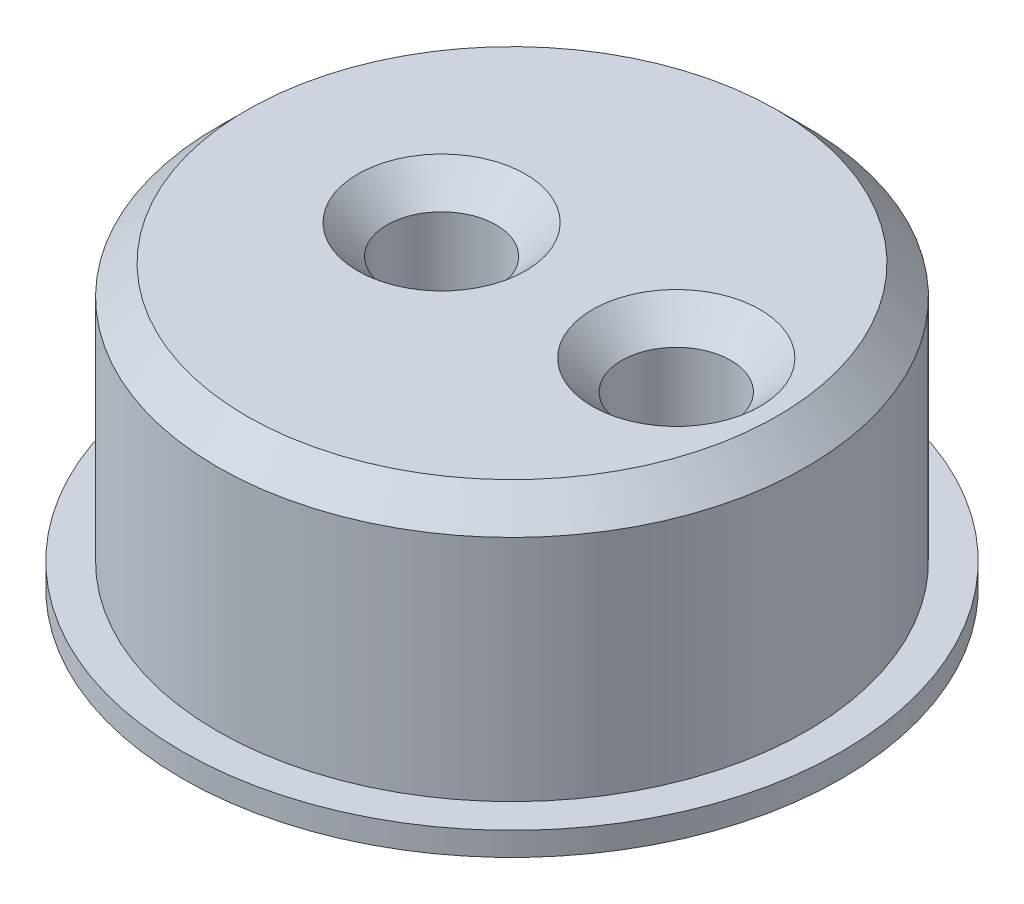
ISO-10303-21;
HEADER;
FILE_DESCRIPTION(('STEP AP214'),'2;1');
FILE_NAME('part.step','',(''),(''),'','','');
FILE_SCHEMA(('AUTOMOTIVE_DESIGN { 1 0 10303 214 1 1 1 1 }'));
ENDSEC;
DATA;
#1=APPLICATION_CONTEXT('core data for automotive mechanical design processes');
#2=APPLICATION_PROTOCOL_DEFINITION('international standard','automotive_design',2000,#1);
#3=PRODUCT_CONTEXT('',#1,'mechanical');
#4=PRODUCT('Part','Part','',(#3));
#5=PRODUCT_RELATED_PRODUCT_CATEGORY('part','',(#4));
#6=PRODUCT_DEFINITION_FORMATION('','',#4);
#7=PRODUCT_DEFINITION_CONTEXT('part definition',#1,'design');
#8=PRODUCT_DEFINITION('design','',#6,#7);
#9=PRODUCT_DEFINITION_SHAPE('','',#8);
#10=(LENGTH_UNIT() NAMED_UNIT(*) SI_UNIT(.MILLI.,.METRE.));
#11=(NAMED_UNIT(*) PLANE_ANGLE_UNIT() SI_UNIT($,.RADIAN.));
#12=(NAMED_UNIT(*) SI_UNIT($,.STERADIAN.) SOLID_ANGLE_UNIT());
#13=UNCERTAINTY_MEASURE_WITH_UNIT(LENGTH_MEASURE(1.E-05),#10,'distance_accuracy_value','');
#14=(GEOMETRIC_REPRESENTATION_CONTEXT(3) GLOBAL_UNCERTAINTY_ASSIGNED_CONTEXT((#13)) GLOBAL_UNIT_ASSIGNED_CONTEXT((#10,
#11,#12)) REPRESENTATION_CONTEXT('',''));
#15=CARTESIAN_POINT('',(0.,0.,0.));
#16=DIRECTION('',(0.,0.,1.));
#17=DIRECTION('',(1.,0.,0.));
#18=AXIS2_PLACEMENT_3D('',#15,#16,#17);
#19=CARTESIAN_POINT('',(0.,4.4,0.));
#20=DIRECTION('',(0.,1.,0.));
#21=DIRECTION('',(0.,0.,1.));
#22=AXIS2_PLACEMENT_3D('',#19,#20,#21);
#23=PLANE('',#22);
#24=CARTESIAN_POINT('',(-1.2,4.4,0.));
#25=DIRECTION('',(0.,1.,0.));
#26=DIRECTION('',(0.,0.,1.));
#27=AXIS2_PLACEMENT_3D('',#24,#25,#26);
#28=CIRCLE('',#27,1.43000000000001);
#29=CARTESIAN_POINT('',(-1.2,4.4,1.43000000000001));
#30=VERTEX_POINT('',#29);
#31=EDGE_CURVE('E43',#30,#30,#28,.F.);
#32=ORIENTED_EDGE('',*,*,#31,.T.);
#33=EDGE_LOOP('',(#32));
#34=FACE_BOUND('',#33,.T.);
#35=CARTESIAN_POINT('',(0.,4.4,0.));
#36=DIRECTION('',(0.,1.,0.));
#37=DIRECTION('',(0.,0.,1.));
#38=AXIS2_PLACEMENT_3D('',#35,#36,#37);
#39=CIRCLE('',#38,4.52);
#40=CARTESIAN_POINT('',(0.,4.4,4.52));
#41=VERTEX_POINT('',#40);
#42=EDGE_CURVE('E47',#41,#41,#39,.T.);
#43=ORIENTED_EDGE('',*,*,#42,.T.);
#44=EDGE_LOOP('',(#43));
#45=FACE_BOUND('',#44,.T.);
#46=CARTESIAN_POINT('',(2.8,4.4,0.));
#47=DIRECTION('',(0.,1.,0.));
#48=DIRECTION('',(0.,0.,1.));
#49=AXIS2_PLACEMENT_3D('',#46,#47,#48);
#50=CIRCLE('',#49,1.43);
#51=CARTESIAN_POINT('',(2.8,4.4,1.43));
#52=VERTEX_POINT('',#51);
#53=EDGE_CURVE('E51',#52,#52,#50,.F.);
#54=ORIENTED_EDGE('',*,*,#53,.T.);
#55=EDGE_LOOP('',(#54));
#56=FACE_BOUND('',#55,.T.);
#57=ADVANCED_FACE('F35',(#34,#45,#56),#23,.T.);
#58=CARTESIAN_POINT('',(0.,4.4,0.));
#59=DIRECTION('',(0.,-1.,0.));
#60=DIRECTION('',(0.,0.,-1.));
#61=AXIS2_PLACEMENT_3D('',#58,#59,#60);
#62=CYLINDRICAL_SURFACE('',#61,5.02);
#63=CARTESIAN_POINT('',(0.,3.9,0.));
#64=DIRECTION('',(0.,1.,0.));
#65=DIRECTION('',(0.,0.,1.));
#66=AXIS2_PLACEMENT_3D('',#63,#64,#65);
#67=CIRCLE('',#66,5.02);
#68=CARTESIAN_POINT('',(0.,3.9,5.02));
#69=VERTEX_POINT('',#68);
#70=EDGE_CURVE('E10',#69,#69,#67,.F.);
#71=ORIENTED_EDGE('',*,*,#70,.T.);
#72=EDGE_LOOP('',(#71));
#73=FACE_BOUND('',#72,.T.);
#74=CARTESIAN_POINT('',(0.,0.,0.));
#75=DIRECTION('',(0.,1.,0.));
#76=DIRECTION('',(0.,0.,1.));
#77=AXIS2_PLACEMENT_3D('',#74,#75,#76);
#78=CIRCLE('',#77,5.02);
#79=CARTESIAN_POINT('',(0.,0.,5.02));
#80=VERTEX_POINT('',#79);
#81=EDGE_CURVE('E74',#80,#80,#78,.T.);
#82=ORIENTED_EDGE('',*,*,#81,.T.);
#83=EDGE_LOOP('',(#82));
#84=FACE_BOUND('',#83,.T.);
#85=ADVANCED_FACE('F105',(#73,#84),#62,.T.);
#86=CARTESIAN_POINT('',(2.8,4.4,0.));
#87=DIRECTION('',(0.,-1.,0.));
#88=DIRECTION('',(0.,0.,-1.));
#89=AXIS2_PLACEMENT_3D('',#86,#87,#88);
#90=CYLINDRICAL_SURFACE('',#89,0.930000000000001);
#91=CARTESIAN_POINT('',(2.8,0.100000000000003,0.));
#92=DIRECTION('',(0.,-1.,0.));
#93=DIRECTION('',(0.,0.,-1.));
#94=AXIS2_PLACEMENT_3D('',#91,#92,#93);
#95=CIRCLE('',#94,0.930000000000001);
#96=CARTESIAN_POINT('',(2.8,0.100000000000003,-0.930000000000001));
#97=VERTEX_POINT('',#96);
#98=EDGE_CURVE('E68',#97,#97,#95,.T.);
#99=ORIENTED_EDGE('',*,*,#98,.T.);
#100=EDGE_LOOP('',(#99));
#101=FACE_BOUND('',#100,.T.);
#102=CARTESIAN_POINT('',(2.8,3.9,0.));
#103=DIRECTION('',(0.,1.,0.));
#104=DIRECTION('',(0.,0.,1.));
#105=AXIS2_PLACEMENT_3D('',#102,#103,#104);
#106=CIRCLE('',#105,0.930000000000001);
#107=CARTESIAN_POINT('',(2.8,3.9,0.930000000000001));
#108=VERTEX_POINT('',#107);
#109=EDGE_CURVE('E71',#108,#108,#106,.T.);
#110=ORIENTED_EDGE('',*,*,#109,.T.);
#111=EDGE_LOOP('',(#110));
#112=FACE_BOUND('',#111,.T.);
#113=ADVANCED_FACE('F110',(#101,#112),#90,.F.);
#114=CARTESIAN_POINT('',(-1.2,4.4,0.));
#115=DIRECTION('',(0.,-1.,0.));
#116=DIRECTION('',(0.,0.,-1.));
#117=AXIS2_PLACEMENT_3D('',#114,#115,#116);
#118=CYLINDRICAL_SURFACE('',#117,0.93);
#119=CARTESIAN_POINT('',(-1.2,0.100000000000002,0.));
#120=DIRECTION('',(0.,-1.,0.));
#121=DIRECTION('',(0.,0.,-1.));
#122=AXIS2_PLACEMENT_3D('',#119,#120,#121);
#123=CIRCLE('',#122,0.93);
#124=CARTESIAN_POINT('',(-1.2,0.100000000000002,-0.93));
#125=VERTEX_POINT('',#124);
#126=EDGE_CURVE('E56',#125,#125,#123,.T.);
#127=ORIENTED_EDGE('',*,*,#126,.T.);
#128=EDGE_LOOP('',(#127));
#129=FACE_BOUND('',#128,.T.);
#130=CARTESIAN_POINT('',(-1.2,3.9,0.));
#131=DIRECTION('',(0.,1.,0.));
#132=DIRECTION('',(0.,0.,1.));
#133=AXIS2_PLACEMENT_3D('',#130,#131,#132);
#134=CIRCLE('',#133,0.93);
#135=CARTESIAN_POINT('',(-1.2,3.9,0.930000000000001));
#136=VERTEX_POINT('',#135);
#137=EDGE_CURVE('E59',#136,#136,#134,.T.);
#138=ORIENTED_EDGE('',*,*,#137,.T.);
#139=EDGE_LOOP('',(#138));
#140=FACE_BOUND('',#139,.T.);
#141=ADVANCED_FACE('F100',(#129,#140),#118,.F.);
#142=CARTESIAN_POINT('',(0.,-0.4,0.));
#143=DIRECTION('',(0.,-1.,0.));
#144=DIRECTION('',(0.,0.,-1.));
#145=AXIS2_PLACEMENT_3D('',#142,#143,#144);
#146=PLANE('',#145);
#147=CARTESIAN_POINT('',(2.8,-0.4,0.));
#148=DIRECTION('',(0.,-1.,0.));
#149=DIRECTION('',(0.,0.,-1.));
#150=AXIS2_PLACEMENT_3D('',#147,#148,#149);
#151=CIRCLE('',#150,1.43000000000001);
#152=CARTESIAN_POINT('',(2.8,-0.4,-1.43000000000001));
#153=VERTEX_POINT('',#152);
#154=EDGE_CURVE('E62',#153,#153,#151,.F.);
#155=ORIENTED_EDGE('',*,*,#154,.T.);
#156=EDGE_LOOP('',(#155));
#157=FACE_BOUND('',#156,.T.);
#158=CARTESIAN_POINT('',(-1.2,-0.4,0.));
#159=DIRECTION('',(0.,-1.,0.));
#160=DIRECTION('',(0.,0.,-1.));
#161=AXIS2_PLACEMENT_3D('',#158,#159,#160);
#162=CIRCLE('',#161,1.43);
#163=CARTESIAN_POINT('',(-1.2,-0.4,-1.43));
#164=VERTEX_POINT('',#163);
#165=EDGE_CURVE('E65',#164,#164,#162,.F.);
#166=ORIENTED_EDGE('',*,*,#165,.T.);
#167=EDGE_LOOP('',(#166));
#168=FACE_BOUND('',#167,.T.);
#169=CARTESIAN_POINT('',(0.,-0.4,0.));
#170=DIRECTION('',(0.,-1.,0.));
#171=DIRECTION('',(0.,0.,-1.));
#172=AXIS2_PLACEMENT_3D('',#169,#170,#171);
#173=CIRCLE('',#172,5.62);
#174=CARTESIAN_POINT('',(0.,-0.4,-5.62));
#175=VERTEX_POINT('',#174);
#176=EDGE_CURVE('E77',#175,#175,#173,.T.);
#177=ORIENTED_EDGE('',*,*,#176,.T.);
#178=EDGE_LOOP('',(#177));
#179=FACE_BOUND('',#178,.T.);
#180=ADVANCED_FACE('F84',(#157,#168,#179),#146,.T.);
#181=CARTESIAN_POINT('',(0.,0.,0.));
#182=DIRECTION('',(0.,-1.,0.));
#183=DIRECTION('',(0.,0.,-1.));
#184=AXIS2_PLACEMENT_3D('',#181,#182,#183);
#185=PLANE('',#184);
#186=ORIENTED_EDGE('',*,*,#81,.F.);
#187=EDGE_LOOP('',(#186));
#188=FACE_BOUND('',#187,.T.);
#189=CARTESIAN_POINT('',(0.,0.,0.));
#190=DIRECTION('',(0.,-1.,0.));
#191=DIRECTION('',(0.,0.,-1.));
#192=AXIS2_PLACEMENT_3D('',#189,#190,#191);
#193=CIRCLE('',#192,5.62);
#194=CARTESIAN_POINT('',(0.,0.,-5.62));
#195=VERTEX_POINT('',#194);
#196=EDGE_CURVE('E78',#195,#195,#193,.T.);
#197=ORIENTED_EDGE('',*,*,#196,.F.);
#198=EDGE_LOOP('',(#197));
#199=FACE_BOUND('',#198,.T.);
#200=ADVANCED_FACE('F90',(#188,#199),#185,.F.);
#201=CARTESIAN_POINT('',(0.,-0.4,0.));
#202=DIRECTION('',(0.,1.,0.));
#203=DIRECTION('',(0.,0.,1.));
#204=AXIS2_PLACEMENT_3D('',#201,#202,#203);
#205=CYLINDRICAL_SURFACE('',#204,5.62);
#206=ORIENTED_EDGE('',*,*,#176,.F.);
#207=EDGE_LOOP('',(#206));
#208=FACE_BOUND('',#207,.T.);
#209=ORIENTED_EDGE('',*,*,#196,.T.);
#210=EDGE_LOOP('',(#209));
#211=FACE_BOUND('',#210,.T.);
#212=ADVANCED_FACE('F86',(#208,#211),#205,.T.);
#213=CARTESIAN_POINT('',(2.8,0.100000000000003,0.));
#214=DIRECTION('',(0.,-1.,0.));
#215=DIRECTION('',(0.,0.,-1.));
#216=AXIS2_PLACEMENT_3D('',#213,#214,#215);
#217=CONICAL_SURFACE('',#216,0.930000000000001,0.78539816339745);
#218=ORIENTED_EDGE('',*,*,#154,.F.);
#219=EDGE_LOOP('',(#218));
#220=FACE_BOUND('',#219,.T.);
#221=ORIENTED_EDGE('',*,*,#98,.F.);
#222=EDGE_LOOP('',(#221));
#223=FACE_BOUND('',#222,.T.);
#224=ADVANCED_FACE('F89',(#220,#223),#217,.F.);
#225=CARTESIAN_POINT('',(-1.2,0.100000000000002,0.));
#226=DIRECTION('',(0.,-1.,0.));
#227=DIRECTION('',(0.,0.,-1.));
#228=AXIS2_PLACEMENT_3D('',#225,#226,#227);
#229=CONICAL_SURFACE('',#228,0.93,0.785398163397448);
#230=ORIENTED_EDGE('',*,*,#165,.F.);
#231=EDGE_LOOP('',(#230));
#232=FACE_BOUND('',#231,.T.);
#233=ORIENTED_EDGE('',*,*,#126,.F.);
#234=EDGE_LOOP('',(#233));
#235=FACE_BOUND('',#234,.T.);
#236=ADVANCED_FACE('F122',(#232,#235),#229,.F.);
#237=CARTESIAN_POINT('',(-1.2,3.9,0.));
#238=DIRECTION('',(0.,1.,0.));
#239=DIRECTION('',(0.,0.,1.));
#240=AXIS2_PLACEMENT_3D('',#237,#238,#239);
#241=CONICAL_SURFACE('',#240,0.93,0.78539816339745);
#242=ORIENTED_EDGE('',*,*,#31,.F.);
#243=EDGE_LOOP('',(#242));
#244=FACE_BOUND('',#243,.T.);
#245=ORIENTED_EDGE('',*,*,#137,.F.);
#246=EDGE_LOOP('',(#245));
#247=FACE_BOUND('',#246,.T.);
#248=ADVANCED_FACE('F129',(#244,#247),#241,.F.);
#249=CARTESIAN_POINT('',(0.,4.4,0.));
#250=DIRECTION('',(0.,-1.,0.));
#251=DIRECTION('',(0.,0.,-1.));
#252=AXIS2_PLACEMENT_3D('',#249,#250,#251);
#253=CONICAL_SURFACE('',#252,4.52,0.785398163397448);
#254=ORIENTED_EDGE('',*,*,#70,.F.);
#255=EDGE_LOOP('',(#254));
#256=FACE_BOUND('',#255,.T.);
#257=ORIENTED_EDGE('',*,*,#42,.F.);
#258=EDGE_LOOP('',(#257));
#259=FACE_BOUND('',#258,.T.);
#260=ADVANCED_FACE('F135',(#256,#259),#253,.T.);
#261=CARTESIAN_POINT('',(2.8,3.9,0.));
#262=DIRECTION('',(0.,1.,0.));
#263=DIRECTION('',(0.,0.,1.));
#264=AXIS2_PLACEMENT_3D('',#261,#262,#263);
#265=CONICAL_SURFACE('',#264,0.930000000000001,0.785398163397448);
#266=ORIENTED_EDGE('',*,*,#53,.F.);
#267=EDGE_LOOP('',(#266));
#268=FACE_BOUND('',#267,.T.);
#269=ORIENTED_EDGE('',*,*,#109,.F.);
#270=EDGE_LOOP('',(#269));
#271=FACE_BOUND('',#270,.T.);
#272=ADVANCED_FACE('F38',(#268,#271),#265,.F.);
#273=CLOSED_SHELL('',(#57,#85,#113,#141,#180,#200,#212,#224,#236,#248,#260,#272));
#274=MANIFOLD_SOLID_BREP('B2',#273);
#275=ADVANCED_BREP_SHAPE_REPRESENTATION('',(#18,#274),#14);
#276=SHAPE_DEFINITION_REPRESENTATION(#9,#275);
ENDSEC;
END-ISO-10303-21;
